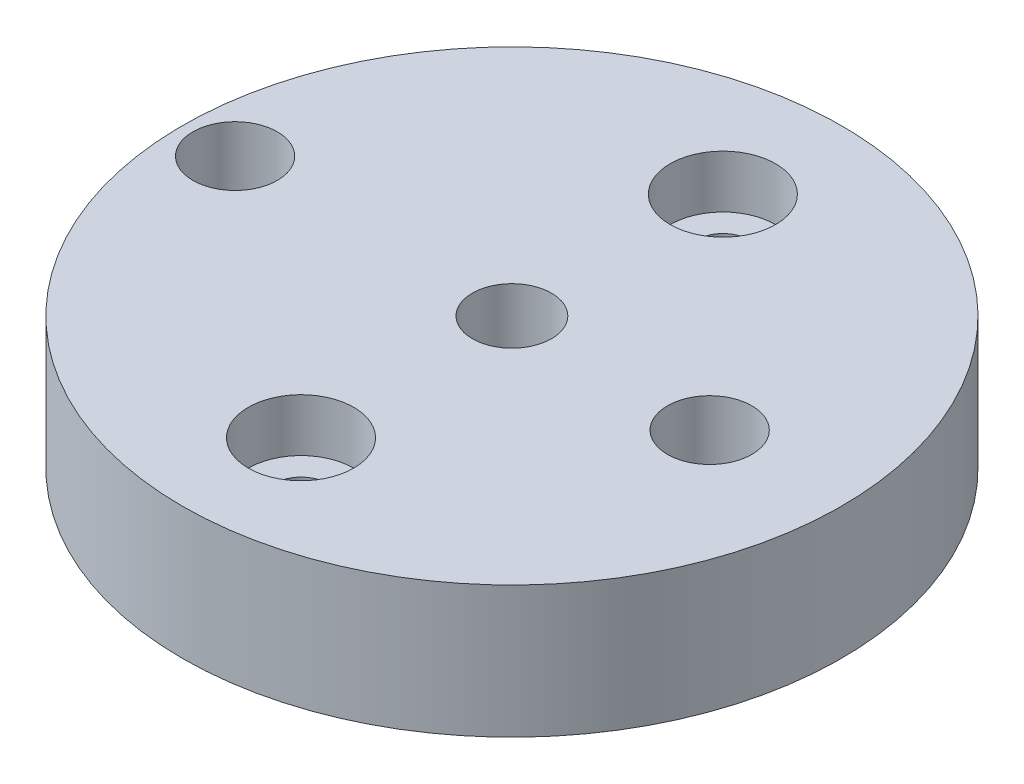
ISO-10303-21;
HEADER;
FILE_DESCRIPTION(('STEP AP214'),'2;1');
FILE_NAME('part.step','',(''),(''),'','','');
FILE_SCHEMA(('AUTOMOTIVE_DESIGN { 1 0 10303 214 1 1 1 1 }'));
ENDSEC;
DATA;
#1=APPLICATION_CONTEXT('core data for automotive mechanical design processes');
#2=APPLICATION_PROTOCOL_DEFINITION('international standard','automotive_design',2000,#1);
#3=PRODUCT_CONTEXT('',#1,'mechanical');
#4=PRODUCT('Part','Part','',(#3));
#5=PRODUCT_RELATED_PRODUCT_CATEGORY('part','',(#4));
#6=PRODUCT_DEFINITION_FORMATION('','',#4);
#7=PRODUCT_DEFINITION_CONTEXT('part definition',#1,'design');
#8=PRODUCT_DEFINITION('design','',#6,#7);
#9=PRODUCT_DEFINITION_SHAPE('','',#8);
#10=(LENGTH_UNIT() NAMED_UNIT(*) SI_UNIT(.MILLI.,.METRE.));
#11=(NAMED_UNIT(*) PLANE_ANGLE_UNIT() SI_UNIT($,.RADIAN.));
#12=(NAMED_UNIT(*) SI_UNIT($,.STERADIAN.) SOLID_ANGLE_UNIT());
#13=UNCERTAINTY_MEASURE_WITH_UNIT(LENGTH_MEASURE(1.E-05),#10,'distance_accuracy_value','');
#14=(GEOMETRIC_REPRESENTATION_CONTEXT(3) GLOBAL_UNCERTAINTY_ASSIGNED_CONTEXT((#13)) GLOBAL_UNIT_ASSIGNED_CONTEXT((#10,
#11,#12)) REPRESENTATION_CONTEXT('',''));
#15=CARTESIAN_POINT('',(0.,0.,0.));
#16=DIRECTION('',(0.,0.,1.));
#17=DIRECTION('',(1.,0.,0.));
#18=AXIS2_PLACEMENT_3D('',#15,#16,#17);
#19=CARTESIAN_POINT('',(0.,5.,8.));
#20=DIRECTION('',(0.,-1.,0.));
#21=DIRECTION('',(0.,0.,-1.));
#22=AXIS2_PLACEMENT_3D('',#19,#20,#21);
#23=CYLINDRICAL_SURFACE('',#22,0.999999999999999);
#24=CARTESIAN_POINT('',(0.,0.,8.));
#25=DIRECTION('',(0.,1.,0.));
#26=DIRECTION('',(0.,0.,1.));
#27=AXIS2_PLACEMENT_3D('',#24,#25,#26);
#28=CIRCLE('',#27,0.999999999999999);
#29=CARTESIAN_POINT('',(0.,0.,9.));
#30=VERTEX_POINT('',#29);
#31=EDGE_CURVE('E53',#30,#30,#28,.T.);
#32=ORIENTED_EDGE('',*,*,#31,.F.);
#33=EDGE_LOOP('',(#32));
#34=FACE_BOUND('',#33,.T.);
#35=CARTESIAN_POINT('',(0.,3.,8.));
#36=DIRECTION('',(0.,1.,0.));
#37=DIRECTION('',(0.,0.,1.));
#38=AXIS2_PLACEMENT_3D('',#35,#36,#37);
#39=CIRCLE('',#38,0.999999999999999);
#40=CARTESIAN_POINT('',(0.,3.,9.));
#41=VERTEX_POINT('',#40);
#42=EDGE_CURVE('E44',#41,#41,#39,.T.);
#43=ORIENTED_EDGE('',*,*,#42,.T.);
#44=EDGE_LOOP('',(#43));
#45=FACE_BOUND('',#44,.T.);
#46=ADVANCED_FACE('F40',(#34,#45),#23,.F.);
#47=CARTESIAN_POINT('',(0.,5.,-8.));
#48=DIRECTION('',(0.,-1.,0.));
#49=DIRECTION('',(0.,0.,-1.));
#50=AXIS2_PLACEMENT_3D('',#47,#48,#49);
#51=CYLINDRICAL_SURFACE('',#50,1.);
#52=CARTESIAN_POINT('',(0.,0.,-8.));
#53=DIRECTION('',(0.,1.,0.));
#54=DIRECTION('',(0.,0.,1.));
#55=AXIS2_PLACEMENT_3D('',#52,#53,#54);
#56=CIRCLE('',#55,1.);
#57=CARTESIAN_POINT('',(0.,0.,-7.));
#58=VERTEX_POINT('',#57);
#59=EDGE_CURVE('E81',#58,#58,#56,.T.);
#60=ORIENTED_EDGE('',*,*,#59,.F.);
#61=EDGE_LOOP('',(#60));
#62=FACE_BOUND('',#61,.T.);
#63=CARTESIAN_POINT('',(0.,3.,-8.));
#64=DIRECTION('',(0.,1.,0.));
#65=DIRECTION('',(0.,0.,1.));
#66=AXIS2_PLACEMENT_3D('',#63,#64,#65);
#67=CIRCLE('',#66,1.);
#68=CARTESIAN_POINT('',(0.,3.,-7.));
#69=VERTEX_POINT('',#68);
#70=EDGE_CURVE('E57',#69,#69,#67,.T.);
#71=ORIENTED_EDGE('',*,*,#70,.T.);
#72=EDGE_LOOP('',(#71));
#73=FACE_BOUND('',#72,.T.);
#74=ADVANCED_FACE('F116',(#62,#73),#51,.F.);
#75=CARTESIAN_POINT('',(0.,5.,0.));
#76=DIRECTION('',(0.,1.,0.));
#77=DIRECTION('',(0.,0.,1.));
#78=AXIS2_PLACEMENT_3D('',#75,#76,#77);
#79=PLANE('',#78);
#80=CARTESIAN_POINT('',(0.,5.,-8.));
#81=DIRECTION('',(0.,1.,0.));
#82=DIRECTION('',(0.,0.,1.));
#83=AXIS2_PLACEMENT_3D('',#80,#81,#82);
#84=CIRCLE('',#83,2.);
#85=CARTESIAN_POINT('',(0.,5.,-6.));
#86=VERTEX_POINT('',#85);
#87=EDGE_CURVE('E65',#86,#86,#84,.T.);
#88=ORIENTED_EDGE('',*,*,#87,.F.);
#89=EDGE_LOOP('',(#88));
#90=FACE_BOUND('',#89,.T.);
#91=CARTESIAN_POINT('',(0.,5.,8.));
#92=DIRECTION('',(0.,1.,0.));
#93=DIRECTION('',(0.,0.,1.));
#94=AXIS2_PLACEMENT_3D('',#91,#92,#93);
#95=CIRCLE('',#94,2.);
#96=CARTESIAN_POINT('',(0.,5.,10.));
#97=VERTEX_POINT('',#96);
#98=EDGE_CURVE('E70',#97,#97,#95,.T.);
#99=ORIENTED_EDGE('',*,*,#98,.F.);
#100=EDGE_LOOP('',(#99));
#101=FACE_BOUND('',#100,.T.);
#102=CARTESIAN_POINT('',(0.,5.,0.));
#103=DIRECTION('',(0.,1.,0.));
#104=DIRECTION('',(0.,0.,1.));
#105=AXIS2_PLACEMENT_3D('',#102,#103,#104);
#106=CIRCLE('',#105,1.5);
#107=CARTESIAN_POINT('',(0.,5.,1.5));
#108=VERTEX_POINT('',#107);
#109=EDGE_CURVE('E93',#108,#108,#106,.T.);
#110=ORIENTED_EDGE('',*,*,#109,.F.);
#111=EDGE_LOOP('',(#110));
#112=FACE_BOUND('',#111,.T.);
#113=CARTESIAN_POINT('',(0.,5.,0.));
#114=DIRECTION('',(0.,1.,0.));
#115=DIRECTION('',(0.,0.,1.));
#116=AXIS2_PLACEMENT_3D('',#113,#114,#115);
#117=CIRCLE('',#116,12.5);
#118=CARTESIAN_POINT('',(0.,5.,12.5));
#119=VERTEX_POINT('',#118);
#120=EDGE_CURVE('E10',#119,#119,#117,.T.);
#121=ORIENTED_EDGE('',*,*,#120,.T.);
#122=EDGE_LOOP('',(#121));
#123=FACE_BOUND('',#122,.T.);
#124=CARTESIAN_POINT('',(-10.5,5.,0.));
#125=DIRECTION('',(0.,1.,0.));
#126=DIRECTION('',(0.,0.,1.));
#127=AXIS2_PLACEMENT_3D('',#124,#125,#126);
#128=CIRCLE('',#127,1.6);
#129=CARTESIAN_POINT('',(-10.5,5.,1.6));
#130=VERTEX_POINT('',#129);
#131=EDGE_CURVE('E87',#130,#130,#128,.T.);
#132=ORIENTED_EDGE('',*,*,#131,.F.);
#133=EDGE_LOOP('',(#132));
#134=FACE_BOUND('',#133,.T.);
#135=CARTESIAN_POINT('',(7.5,5.,0.));
#136=DIRECTION('',(0.,1.,0.));
#137=DIRECTION('',(0.,0.,1.));
#138=AXIS2_PLACEMENT_3D('',#135,#136,#137);
#139=CIRCLE('',#138,1.6);
#140=CARTESIAN_POINT('',(7.5,5.,1.6));
#141=VERTEX_POINT('',#140);
#142=EDGE_CURVE('E78',#141,#141,#139,.T.);
#143=ORIENTED_EDGE('',*,*,#142,.F.);
#144=EDGE_LOOP('',(#143));
#145=FACE_BOUND('',#144,.T.);
#146=ADVANCED_FACE('F122',(#90,#101,#112,#123,#134,#145),#79,.T.);
#147=CARTESIAN_POINT('',(0.,0.,0.));
#148=DIRECTION('',(0.,1.,0.));
#149=DIRECTION('',(0.,0.,1.));
#150=AXIS2_PLACEMENT_3D('',#147,#148,#149);
#151=PLANE('',#150);
#152=CARTESIAN_POINT('',(0.,0.,0.));
#153=DIRECTION('',(0.,1.,0.));
#154=DIRECTION('',(0.,0.,1.));
#155=AXIS2_PLACEMENT_3D('',#152,#153,#154);
#156=CIRCLE('',#155,12.5);
#157=CARTESIAN_POINT('',(0.,0.,12.5));
#158=VERTEX_POINT('',#157);
#159=EDGE_CURVE('E48',#158,#158,#156,.T.);
#160=ORIENTED_EDGE('',*,*,#159,.F.);
#161=EDGE_LOOP('',(#160));
#162=FACE_BOUND('',#161,.T.);
#163=ORIENTED_EDGE('',*,*,#31,.T.);
#164=EDGE_LOOP('',(#163));
#165=FACE_BOUND('',#164,.T.);
#166=CARTESIAN_POINT('',(0.,0.,0.));
#167=DIRECTION('',(0.,1.,0.));
#168=DIRECTION('',(0.,0.,1.));
#169=AXIS2_PLACEMENT_3D('',#166,#167,#168);
#170=CIRCLE('',#169,1.5);
#171=CARTESIAN_POINT('',(0.,0.,1.5));
#172=VERTEX_POINT('',#171);
#173=EDGE_CURVE('E90',#172,#172,#170,.T.);
#174=ORIENTED_EDGE('',*,*,#173,.T.);
#175=EDGE_LOOP('',(#174));
#176=FACE_BOUND('',#175,.T.);
#177=CARTESIAN_POINT('',(-10.5,0.,0.));
#178=DIRECTION('',(0.,1.,0.));
#179=DIRECTION('',(0.,0.,1.));
#180=AXIS2_PLACEMENT_3D('',#177,#178,#179);
#181=CIRCLE('',#180,1.6);
#182=CARTESIAN_POINT('',(-10.5,0.,1.6));
#183=VERTEX_POINT('',#182);
#184=EDGE_CURVE('E86',#183,#183,#181,.T.);
#185=ORIENTED_EDGE('',*,*,#184,.T.);
#186=EDGE_LOOP('',(#185));
#187=FACE_BOUND('',#186,.T.);
#188=ORIENTED_EDGE('',*,*,#59,.T.);
#189=EDGE_LOOP('',(#188));
#190=FACE_BOUND('',#189,.T.);
#191=CARTESIAN_POINT('',(7.5,0.,0.));
#192=DIRECTION('',(0.,1.,0.));
#193=DIRECTION('',(0.,0.,1.));
#194=AXIS2_PLACEMENT_3D('',#191,#192,#193);
#195=CIRCLE('',#194,1.6);
#196=CARTESIAN_POINT('',(7.5,0.,1.6));
#197=VERTEX_POINT('',#196);
#198=EDGE_CURVE('E63',#197,#197,#195,.T.);
#199=ORIENTED_EDGE('',*,*,#198,.T.);
#200=EDGE_LOOP('',(#199));
#201=FACE_BOUND('',#200,.T.);
#202=ADVANCED_FACE('F98',(#162,#165,#176,#187,#190,#201),#151,.F.);
#203=CARTESIAN_POINT('',(0.,5.,0.));
#204=DIRECTION('',(0.,-1.,0.));
#205=DIRECTION('',(0.,0.,-1.));
#206=AXIS2_PLACEMENT_3D('',#203,#204,#205);
#207=CYLINDRICAL_SURFACE('',#206,12.5);
#208=ORIENTED_EDGE('',*,*,#120,.F.);
#209=EDGE_LOOP('',(#208));
#210=FACE_BOUND('',#209,.T.);
#211=ORIENTED_EDGE('',*,*,#159,.T.);
#212=EDGE_LOOP('',(#211));
#213=FACE_BOUND('',#212,.T.);
#214=ADVANCED_FACE('F42',(#210,#213),#207,.T.);
#215=CARTESIAN_POINT('',(0.,5.,0.));
#216=DIRECTION('',(0.,-1.,0.));
#217=DIRECTION('',(0.,0.,-1.));
#218=AXIS2_PLACEMENT_3D('',#215,#216,#217);
#219=CYLINDRICAL_SURFACE('',#218,1.5);
#220=ORIENTED_EDGE('',*,*,#109,.T.);
#221=EDGE_LOOP('',(#220));
#222=FACE_BOUND('',#221,.T.);
#223=ORIENTED_EDGE('',*,*,#173,.F.);
#224=EDGE_LOOP('',(#223));
#225=FACE_BOUND('',#224,.T.);
#226=ADVANCED_FACE('F101',(#222,#225),#219,.F.);
#227=CARTESIAN_POINT('',(-10.5,5.,0.));
#228=DIRECTION('',(0.,-1.,0.));
#229=DIRECTION('',(0.,0.,-1.));
#230=AXIS2_PLACEMENT_3D('',#227,#228,#229);
#231=CYLINDRICAL_SURFACE('',#230,1.6);
#232=ORIENTED_EDGE('',*,*,#131,.T.);
#233=EDGE_LOOP('',(#232));
#234=FACE_BOUND('',#233,.T.);
#235=ORIENTED_EDGE('',*,*,#184,.F.);
#236=EDGE_LOOP('',(#235));
#237=FACE_BOUND('',#236,.T.);
#238=ADVANCED_FACE('F103',(#234,#237),#231,.F.);
#239=CARTESIAN_POINT('',(7.5,5.,0.));
#240=DIRECTION('',(0.,-1.,0.));
#241=DIRECTION('',(0.,0.,-1.));
#242=AXIS2_PLACEMENT_3D('',#239,#240,#241);
#243=CYLINDRICAL_SURFACE('',#242,1.6);
#244=ORIENTED_EDGE('',*,*,#142,.T.);
#245=EDGE_LOOP('',(#244));
#246=FACE_BOUND('',#245,.T.);
#247=ORIENTED_EDGE('',*,*,#198,.F.);
#248=EDGE_LOOP('',(#247));
#249=FACE_BOUND('',#248,.T.);
#250=ADVANCED_FACE('F110',(#246,#249),#243,.F.);
#251=CARTESIAN_POINT('',(0.,3.,-8.));
#252=DIRECTION('',(0.,1.,0.));
#253=DIRECTION('',(0.,0.,1.));
#254=AXIS2_PLACEMENT_3D('',#251,#252,#253);
#255=CYLINDRICAL_SURFACE('',#254,2.);
#256=CARTESIAN_POINT('',(0.,3.,-8.));
#257=DIRECTION('',(0.,1.,0.));
#258=DIRECTION('',(0.,0.,1.));
#259=AXIS2_PLACEMENT_3D('',#256,#257,#258);
#260=CIRCLE('',#259,2.);
#261=CARTESIAN_POINT('',(0.,3.,-6.));
#262=VERTEX_POINT('',#261);
#263=EDGE_CURVE('E59',#262,#262,#260,.T.);
#264=ORIENTED_EDGE('',*,*,#263,.F.);
#265=EDGE_LOOP('',(#264));
#266=FACE_BOUND('',#265,.T.);
#267=ORIENTED_EDGE('',*,*,#87,.T.);
#268=EDGE_LOOP('',(#267));
#269=FACE_BOUND('',#268,.T.);
#270=ADVANCED_FACE('F165',(#266,#269),#255,.F.);
#271=CARTESIAN_POINT('',(0.,3.,-8.));
#272=DIRECTION('',(0.,1.,0.));
#273=DIRECTION('',(0.,0.,1.));
#274=AXIS2_PLACEMENT_3D('',#271,#272,#273);
#275=PLANE('',#274);
#276=ORIENTED_EDGE('',*,*,#70,.F.);
#277=EDGE_LOOP('',(#276));
#278=FACE_BOUND('',#277,.T.);
#279=ORIENTED_EDGE('',*,*,#263,.T.);
#280=EDGE_LOOP('',(#279));
#281=FACE_BOUND('',#280,.T.);
#282=ADVANCED_FACE('F188',(#278,#281),#275,.T.);
#283=CARTESIAN_POINT('',(0.,3.,8.));
#284=DIRECTION('',(0.,1.,0.));
#285=DIRECTION('',(0.,0.,1.));
#286=AXIS2_PLACEMENT_3D('',#283,#284,#285);
#287=CYLINDRICAL_SURFACE('',#286,2.);
#288=CARTESIAN_POINT('',(0.,3.,8.));
#289=DIRECTION('',(0.,1.,0.));
#290=DIRECTION('',(0.,0.,1.));
#291=AXIS2_PLACEMENT_3D('',#288,#289,#290);
#292=CIRCLE('',#291,2.);
#293=CARTESIAN_POINT('',(0.,3.,10.));
#294=VERTEX_POINT('',#293);
#295=EDGE_CURVE('E75',#294,#294,#292,.T.);
#296=ORIENTED_EDGE('',*,*,#295,.F.);
#297=EDGE_LOOP('',(#296));
#298=FACE_BOUND('',#297,.T.);
#299=ORIENTED_EDGE('',*,*,#98,.T.);
#300=EDGE_LOOP('',(#299));
#301=FACE_BOUND('',#300,.T.);
#302=ADVANCED_FACE('F195',(#298,#301),#287,.F.);
#303=CARTESIAN_POINT('',(0.,3.,8.));
#304=DIRECTION('',(0.,1.,0.));
#305=DIRECTION('',(0.,0.,1.));
#306=AXIS2_PLACEMENT_3D('',#303,#304,#305);
#307=PLANE('',#306);
#308=ORIENTED_EDGE('',*,*,#42,.F.);
#309=EDGE_LOOP('',(#308));
#310=FACE_BOUND('',#309,.T.);
#311=ORIENTED_EDGE('',*,*,#295,.T.);
#312=EDGE_LOOP('',(#311));
#313=FACE_BOUND('',#312,.T.);
#314=ADVANCED_FACE('F203',(#310,#313),#307,.T.);
#315=CLOSED_SHELL('',(#46,#74,#146,#202,#214,#226,#238,#250,#270,#282,#302,#314));
#316=MANIFOLD_SOLID_BREP('B2',#315);
#317=ADVANCED_BREP_SHAPE_REPRESENTATION('',(#18,#316),#14);
#318=SHAPE_DEFINITION_REPRESENTATION(#9,#317);
ENDSEC;
END-ISO-10303-21;
